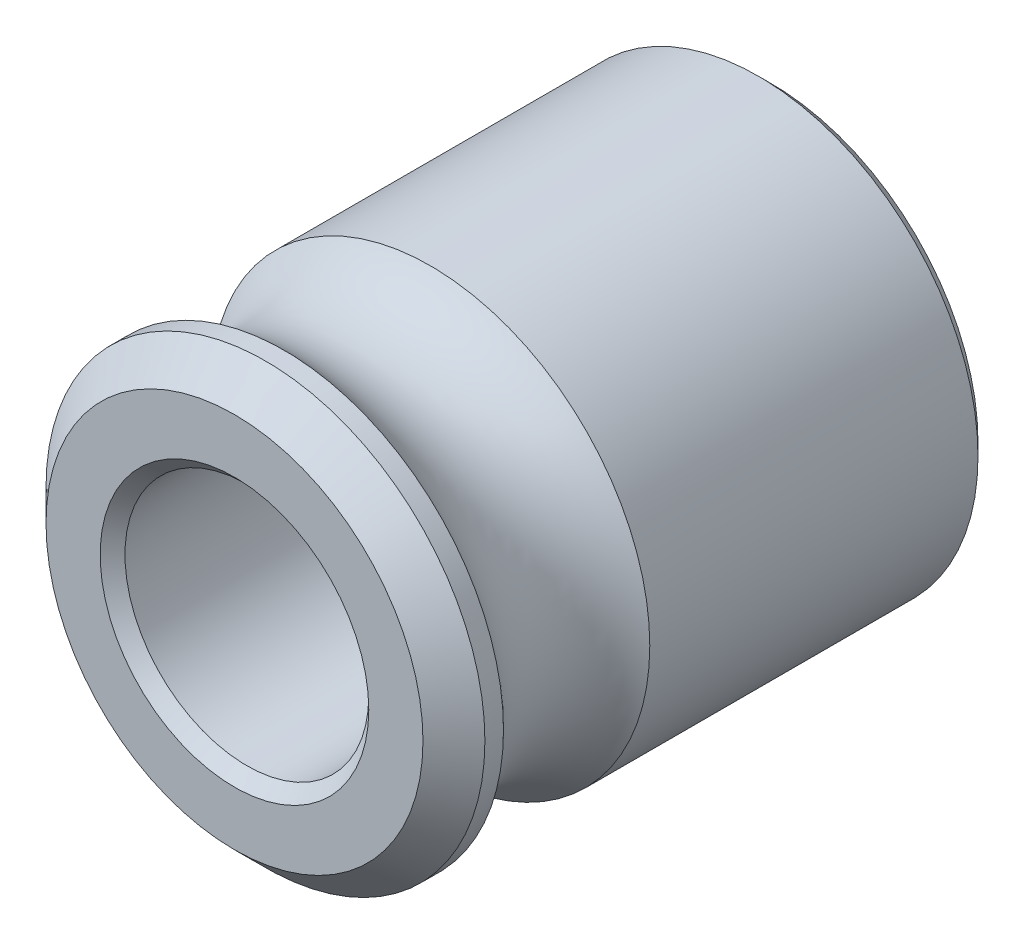
ISO-10303-21;
HEADER;
FILE_DESCRIPTION(('STEP AP214'),'2;1');
FILE_NAME('part.step','',(''),(''),'','','');
FILE_SCHEMA(('AUTOMOTIVE_DESIGN { 1 0 10303 214 1 1 1 1 }'));
ENDSEC;
DATA;
#1=APPLICATION_CONTEXT('core data for automotive mechanical design processes');
#2=APPLICATION_PROTOCOL_DEFINITION('international standard','automotive_design',2000,#1);
#3=PRODUCT_CONTEXT('',#1,'mechanical');
#4=PRODUCT('Part','Part','',(#3));
#5=PRODUCT_RELATED_PRODUCT_CATEGORY('part','',(#4));
#6=PRODUCT_DEFINITION_FORMATION('','',#4);
#7=PRODUCT_DEFINITION_CONTEXT('part definition',#1,'design');
#8=PRODUCT_DEFINITION('design','',#6,#7);
#9=PRODUCT_DEFINITION_SHAPE('','',#8);
#10=(LENGTH_UNIT() NAMED_UNIT(*) SI_UNIT(.MILLI.,.METRE.));
#11=(NAMED_UNIT(*) PLANE_ANGLE_UNIT() SI_UNIT($,.RADIAN.));
#12=(NAMED_UNIT(*) SI_UNIT($,.STERADIAN.) SOLID_ANGLE_UNIT());
#13=UNCERTAINTY_MEASURE_WITH_UNIT(LENGTH_MEASURE(1.E-05),#10,'distance_accuracy_value','');
#14=(GEOMETRIC_REPRESENTATION_CONTEXT(3) GLOBAL_UNCERTAINTY_ASSIGNED_CONTEXT((#13)) GLOBAL_UNIT_ASSIGNED_CONTEXT((#10,
#11,#12)) REPRESENTATION_CONTEXT('',''));
#15=CARTESIAN_POINT('',(0.,0.,0.));
#16=DIRECTION('',(0.,0.,1.));
#17=DIRECTION('',(1.,0.,0.));
#18=AXIS2_PLACEMENT_3D('',#15,#16,#17);
#19=CARTESIAN_POINT('',(0.,0.,11.));
#20=DIRECTION('',(0.,0.,-1.));
#21=DIRECTION('',(-1.,0.,0.));
#22=AXIS2_PLACEMENT_3D('',#19,#20,#21);
#23=CYLINDRICAL_SURFACE('',#22,4.5);
#24=CARTESIAN_POINT('',(0.,0.,10.365));
#25=DIRECTION('',(0.,0.,1.));
#26=DIRECTION('',(1.,0.,0.));
#27=AXIS2_PLACEMENT_3D('',#24,#25,#26);
#28=CIRCLE('',#27,4.5);
#29=CARTESIAN_POINT('',(4.5,0.,10.365));
#30=VERTEX_POINT('',#29);
#31=EDGE_CURVE('E57',#30,#30,#28,.F.);
#32=ORIENTED_EDGE('',*,*,#31,.T.);
#33=EDGE_LOOP('',(#32));
#34=FACE_BOUND('',#33,.T.);
#35=CARTESIAN_POINT('',(0.,0.,9.984));
#36=DIRECTION('',(0.,0.,-1.));
#37=DIRECTION('',(-1.,0.,0.));
#38=AXIS2_PLACEMENT_3D('',#35,#36,#37);
#39=CIRCLE('',#38,4.5);
#40=CARTESIAN_POINT('',(-4.5,0.,9.984));
#41=VERTEX_POINT('',#40);
#42=EDGE_CURVE('E63',#41,#41,#39,.F.);
#43=ORIENTED_EDGE('',*,*,#42,.T.);
#44=EDGE_LOOP('',(#43));
#45=FACE_BOUND('',#44,.T.);
#46=ADVANCED_FACE('F31',(#34,#45),#23,.T.);
#47=CARTESIAN_POINT('',(0.,0.,11.));
#48=DIRECTION('',(0.,0.,1.));
#49=DIRECTION('',(1.,0.,0.));
#50=AXIS2_PLACEMENT_3D('',#47,#48,#49);
#51=PLANE('',#50);
#52=CARTESIAN_POINT('',(0.,0.,11.));
#53=DIRECTION('',(0.,0.,1.));
#54=DIRECTION('',(1.,0.,0.));
#55=AXIS2_PLACEMENT_3D('',#52,#53,#54);
#56=CIRCLE('',#55,2.75400000000001);
#57=CARTESIAN_POINT('',(2.75400000000001,0.,11.));
#58=VERTEX_POINT('',#57);
#59=EDGE_CURVE('E10',#58,#58,#56,.F.);
#60=ORIENTED_EDGE('',*,*,#59,.T.);
#61=EDGE_LOOP('',(#60));
#62=FACE_BOUND('',#61,.T.);
#63=CARTESIAN_POINT('',(0.,0.,11.));
#64=DIRECTION('',(0.,0.,1.));
#65=DIRECTION('',(1.,0.,0.));
#66=AXIS2_PLACEMENT_3D('',#63,#64,#65);
#67=CIRCLE('',#66,3.865);
#68=CARTESIAN_POINT('',(3.865,0.,11.));
#69=VERTEX_POINT('',#68);
#70=EDGE_CURVE('E60',#69,#69,#67,.T.);
#71=ORIENTED_EDGE('',*,*,#70,.T.);
#72=EDGE_LOOP('',(#71));
#73=FACE_BOUND('',#72,.T.);
#74=ADVANCED_FACE('F81',(#62,#73),#51,.T.);
#75=CARTESIAN_POINT('',(0.,0.,0.));
#76=DIRECTION('',(0.,0.,1.));
#77=DIRECTION('',(1.,0.,0.));
#78=AXIS2_PLACEMENT_3D('',#75,#76,#77);
#79=PLANE('',#78);
#80=CARTESIAN_POINT('',(0.,0.,0.));
#81=DIRECTION('',(0.,0.,1.));
#82=DIRECTION('',(1.,0.,0.));
#83=AXIS2_PLACEMENT_3D('',#80,#81,#82);
#84=CIRCLE('',#83,2.754);
#85=CARTESIAN_POINT('',(2.754,0.,0.));
#86=VERTEX_POINT('',#85);
#87=EDGE_CURVE('E51',#86,#86,#84,.T.);
#88=ORIENTED_EDGE('',*,*,#87,.T.);
#89=EDGE_LOOP('',(#88));
#90=FACE_BOUND('',#89,.T.);
#91=CARTESIAN_POINT('',(0.,0.,0.));
#92=DIRECTION('',(0.,0.,1.));
#93=DIRECTION('',(1.,0.,0.));
#94=AXIS2_PLACEMENT_3D('',#91,#92,#93);
#95=CIRCLE('',#94,4.246);
#96=CARTESIAN_POINT('',(4.246,0.,0.));
#97=VERTEX_POINT('',#96);
#98=EDGE_CURVE('E54',#97,#97,#95,.F.);
#99=ORIENTED_EDGE('',*,*,#98,.T.);
#100=EDGE_LOOP('',(#99));
#101=FACE_BOUND('',#100,.T.);
#102=ADVANCED_FACE('F87',(#90,#101),#79,.F.);
#103=CARTESIAN_POINT('',(0.,0.,0.254000000000001));
#104=DIRECTION('',(0.,0.,1.));
#105=DIRECTION('',(1.,0.,0.));
#106=AXIS2_PLACEMENT_3D('',#103,#104,#105);
#107=CIRCLE('',#106,4.5);
#108=CARTESIAN_POINT('',(4.5,0.,0.254000000000001));
#109=VERTEX_POINT('',#108);
#110=EDGE_CURVE('E38',#109,#109,#107,.T.);
#111=ORIENTED_EDGE('',*,*,#110,.T.);
#112=EDGE_LOOP('',(#111));
#113=FACE_BOUND('',#112,.T.);
#114=CARTESIAN_POINT('',(0.,0.,6.984));
#115=DIRECTION('',(0.,0.,1.));
#116=DIRECTION('',(1.,0.,0.));
#117=AXIS2_PLACEMENT_3D('',#114,#115,#116);
#118=CIRCLE('',#117,4.5);
#119=CARTESIAN_POINT('',(4.5,0.,6.984));
#120=VERTEX_POINT('',#119);
#121=EDGE_CURVE('E66',#120,#120,#118,.F.);
#122=ORIENTED_EDGE('',*,*,#121,.T.);
#123=EDGE_LOOP('',(#122));
#124=FACE_BOUND('',#123,.T.);
#125=ADVANCED_FACE('F70',(#113,#124),#23,.T.);
#126=CARTESIAN_POINT('',(0.,0.,11.));
#127=DIRECTION('',(0.,0.,-1.));
#128=DIRECTION('',(-1.,0.,0.));
#129=AXIS2_PLACEMENT_3D('',#126,#127,#128);
#130=CYLINDRICAL_SURFACE('',#129,2.5);
#131=CARTESIAN_POINT('',(0.,0.,0.253999999999999));
#132=DIRECTION('',(0.,0.,1.));
#133=DIRECTION('',(1.,0.,0.));
#134=AXIS2_PLACEMENT_3D('',#131,#132,#133);
#135=CIRCLE('',#134,2.5);
#136=CARTESIAN_POINT('',(2.5,0.,0.253999999999999));
#137=VERTEX_POINT('',#136);
#138=EDGE_CURVE('E42',#137,#137,#135,.F.);
#139=ORIENTED_EDGE('',*,*,#138,.T.);
#140=EDGE_LOOP('',(#139));
#141=FACE_BOUND('',#140,.T.);
#142=CARTESIAN_POINT('',(0.,0.,10.746));
#143=DIRECTION('',(0.,0.,1.));
#144=DIRECTION('',(1.,0.,0.));
#145=AXIS2_PLACEMENT_3D('',#142,#143,#144);
#146=CIRCLE('',#145,2.5);
#147=CARTESIAN_POINT('',(2.5,0.,10.746));
#148=VERTEX_POINT('',#147);
#149=EDGE_CURVE('E46',#148,#148,#146,.T.);
#150=ORIENTED_EDGE('',*,*,#149,.T.);
#151=EDGE_LOOP('',(#150));
#152=FACE_BOUND('',#151,.T.);
#153=ADVANCED_FACE('F76',(#141,#152),#130,.F.);
#154=CARTESIAN_POINT('',(0.,0.,8.484));
#155=DIRECTION('',(0.,0.,1.));
#156=DIRECTION('',(1.,0.,0.));
#157=AXIS2_PLACEMENT_3D('',#154,#155,#156);
#158=TOROIDAL_SURFACE('',#157,5.8228756555323,2.);
#159=ORIENTED_EDGE('',*,*,#121,.F.);
#160=EDGE_LOOP('',(#159));
#161=FACE_BOUND('',#160,.T.);
#162=ORIENTED_EDGE('',*,*,#42,.F.);
#163=EDGE_LOOP('',(#162));
#164=FACE_BOUND('',#163,.T.);
#165=ADVANCED_FACE('F72',(#161,#164),#158,.F.);
#166=CARTESIAN_POINT('',(0.,0.,11.));
#167=DIRECTION('',(0.,0.,-1.));
#168=DIRECTION('',(-1.,0.,0.));
#169=AXIS2_PLACEMENT_3D('',#166,#167,#168);
#170=CONICAL_SURFACE('',#169,3.865,0.785398163397444);
#171=ORIENTED_EDGE('',*,*,#31,.F.);
#172=EDGE_LOOP('',(#171));
#173=FACE_BOUND('',#172,.T.);
#174=ORIENTED_EDGE('',*,*,#70,.F.);
#175=EDGE_LOOP('',(#174));
#176=FACE_BOUND('',#175,.T.);
#177=ADVANCED_FACE('F75',(#173,#176),#170,.T.);
#178=CARTESIAN_POINT('',(0.,0.,0.));
#179=DIRECTION('',(0.,0.,-1.));
#180=DIRECTION('',(-1.,0.,0.));
#181=AXIS2_PLACEMENT_3D('',#178,#179,#180);
#182=CONICAL_SURFACE('',#181,2.754,0.785398163397449);
#183=ORIENTED_EDGE('',*,*,#138,.F.);
#184=EDGE_LOOP('',(#183));
#185=FACE_BOUND('',#184,.T.);
#186=ORIENTED_EDGE('',*,*,#87,.F.);
#187=EDGE_LOOP('',(#186));
#188=FACE_BOUND('',#187,.T.);
#189=ADVANCED_FACE('F108',(#185,#188),#182,.F.);
#190=CARTESIAN_POINT('',(0.,0.,0.254000000000001));
#191=DIRECTION('',(0.,0.,1.));
#192=DIRECTION('',(1.,0.,0.));
#193=AXIS2_PLACEMENT_3D('',#190,#191,#192);
#194=CONICAL_SURFACE('',#193,4.5,0.78539816339745);
#195=ORIENTED_EDGE('',*,*,#98,.F.);
#196=EDGE_LOOP('',(#195));
#197=FACE_BOUND('',#196,.T.);
#198=ORIENTED_EDGE('',*,*,#110,.F.);
#199=EDGE_LOOP('',(#198));
#200=FACE_BOUND('',#199,.T.);
#201=ADVANCED_FACE('F105',(#197,#200),#194,.T.);
#202=CARTESIAN_POINT('',(0.,0.,10.746));
#203=DIRECTION('',(0.,0.,1.));
#204=DIRECTION('',(1.,0.,0.));
#205=AXIS2_PLACEMENT_3D('',#202,#203,#204);
#206=CONICAL_SURFACE('',#205,2.5,0.785398163397456);
#207=ORIENTED_EDGE('',*,*,#59,.F.);
#208=EDGE_LOOP('',(#207));
#209=FACE_BOUND('',#208,.T.);
#210=ORIENTED_EDGE('',*,*,#149,.F.);
#211=EDGE_LOOP('',(#210));
#212=FACE_BOUND('',#211,.T.);
#213=ADVANCED_FACE('F33',(#209,#212),#206,.F.);
#214=CLOSED_SHELL('',(#46,#74,#102,#125,#153,#165,#177,#189,#201,#213));
#215=MANIFOLD_SOLID_BREP('B2',#214);
#216=ADVANCED_BREP_SHAPE_REPRESENTATION('',(#18,#215),#14);
#217=SHAPE_DEFINITION_REPRESENTATION(#9,#216);
ENDSEC;
END-ISO-10303-21;
